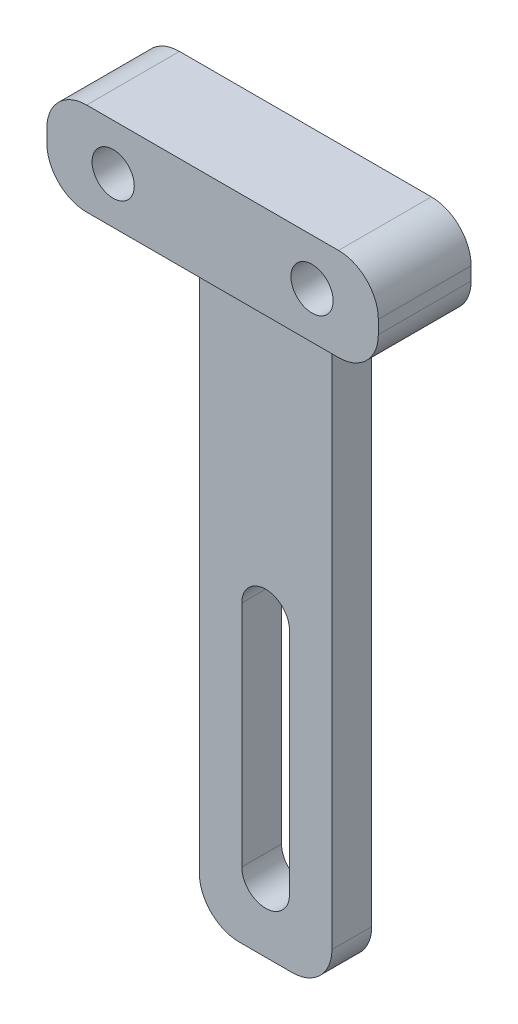
ISO-10303-21;
HEADER;
FILE_DESCRIPTION(('STEP AP214'),'2;1');
FILE_NAME('part.step','',(''),(''),'','','');
FILE_SCHEMA(('AUTOMOTIVE_DESIGN { 1 0 10303 214 1 1 1 1 }'));
ENDSEC;
DATA;
#1=APPLICATION_CONTEXT('core data for automotive mechanical design processes');
#2=APPLICATION_PROTOCOL_DEFINITION('international standard','automotive_design',2000,#1);
#3=PRODUCT_CONTEXT('',#1,'mechanical');
#4=PRODUCT('Part','Part','',(#3));
#5=PRODUCT_RELATED_PRODUCT_CATEGORY('part','',(#4));
#6=PRODUCT_DEFINITION_FORMATION('','',#4);
#7=PRODUCT_DEFINITION_CONTEXT('part definition',#1,'design');
#8=PRODUCT_DEFINITION('design','',#6,#7);
#9=PRODUCT_DEFINITION_SHAPE('','',#8);
#10=(LENGTH_UNIT() NAMED_UNIT(*) SI_UNIT(.MILLI.,.METRE.));
#11=(NAMED_UNIT(*) PLANE_ANGLE_UNIT() SI_UNIT($,.RADIAN.));
#12=(NAMED_UNIT(*) SI_UNIT($,.STERADIAN.) SOLID_ANGLE_UNIT());
#13=UNCERTAINTY_MEASURE_WITH_UNIT(LENGTH_MEASURE(1.E-05),#10,'distance_accuracy_value','');
#14=(GEOMETRIC_REPRESENTATION_CONTEXT(3) GLOBAL_UNCERTAINTY_ASSIGNED_CONTEXT((#13)) GLOBAL_UNIT_ASSIGNED_CONTEXT((#10,
#11,#12)) REPRESENTATION_CONTEXT('',''));
#15=CARTESIAN_POINT('',(0.,0.,0.));
#16=DIRECTION('',(0.,0.,1.));
#17=DIRECTION('',(1.,0.,0.));
#18=AXIS2_PLACEMENT_3D('',#15,#16,#17);
#19=CARTESIAN_POINT('',(0.,0.,3.));
#20=DIRECTION('',(0.,0.,1.));
#21=DIRECTION('',(1.,0.,0.));
#22=AXIS2_PLACEMENT_3D('',#19,#20,#21);
#23=PLANE('',#22);
#24=DIRECTION('',(0.,-1.,0.));
#25=VECTOR('',#24,1.);
#26=CARTESIAN_POINT('',(-22.5496659852599,17.2378238341969,3.));
#27=LINE('',#26,#25);
#28=CARTESIAN_POINT('',(-22.5496659852599,14.2378238341969,3.));
#29=VERTEX_POINT('',#28);
#30=CARTESIAN_POINT('',(-22.5496659852599,-25.6844897396889,3.));
#31=VERTEX_POINT('',#30);
#32=EDGE_CURVE('E216',#29,#31,#27,.T.);
#33=ORIENTED_EDGE('',*,*,#32,.T.);
#34=CARTESIAN_POINT('',(-19.5496659852599,-25.6844897396889,3.));
#35=DIRECTION('',(0.,0.,1.));
#36=DIRECTION('',(1.,0.,0.));
#37=AXIS2_PLACEMENT_3D('',#34,#35,#36);
#38=CIRCLE('',#37,3.);
#39=CARTESIAN_POINT('',(-19.5496659852599,-28.6844897396889,3.));
#40=VERTEX_POINT('',#39);
#41=EDGE_CURVE('E281',#31,#40,#38,.T.);
#42=ORIENTED_EDGE('',*,*,#41,.T.);
#43=DIRECTION('',(1.,0.,0.));
#44=VECTOR('',#43,1.);
#45=CARTESIAN_POINT('',(-22.5496659852599,-28.6844897396889,3.));
#46=LINE('',#45,#44);
#47=CARTESIAN_POINT('',(-15.5496659852599,-28.6844897396889,3.));
#48=VERTEX_POINT('',#47);
#49=EDGE_CURVE('E219',#40,#48,#46,.T.);
#50=ORIENTED_EDGE('',*,*,#49,.T.);
#51=CARTESIAN_POINT('',(-15.5496659852599,-25.6844897396889,3.));
#52=DIRECTION('',(0.,0.,1.));
#53=DIRECTION('',(1.,0.,0.));
#54=AXIS2_PLACEMENT_3D('',#51,#52,#53);
#55=CIRCLE('',#54,3.);
#56=CARTESIAN_POINT('',(-12.5496659852599,-25.6844897396889,3.));
#57=VERTEX_POINT('',#56);
#58=EDGE_CURVE('E279',#48,#57,#55,.T.);
#59=ORIENTED_EDGE('',*,*,#58,.T.);
#60=DIRECTION('',(0.,1.,0.));
#61=VECTOR('',#60,1.);
#62=CARTESIAN_POINT('',(-12.5496659852599,17.2378238341969,3.));
#63=LINE('',#62,#61);
#64=CARTESIAN_POINT('',(-12.5496659852599,14.2378238341969,3.));
#65=VERTEX_POINT('',#64);
#66=EDGE_CURVE('E223',#57,#65,#63,.T.);
#67=ORIENTED_EDGE('',*,*,#66,.T.);
#68=DIRECTION('',(1.,0.,0.));
#69=VECTOR('',#68,1.);
#70=CARTESIAN_POINT('',(0.,14.2378238341969,3.));
#71=LINE('',#70,#69);
#72=EDGE_CURVE('E277',#65,#29,#71,.F.);
#73=ORIENTED_EDGE('',*,*,#72,.T.);
#74=EDGE_LOOP('',(#33,#42,#50,#59,#67,#73));
#75=FACE_BOUND('',#74,.T.);
#76=DIRECTION('',(0.,1.,0.));
#77=VECTOR('',#76,1.);
#78=CARTESIAN_POINT('',(-15.7496659852599,-23.6844897396889,3.));
#79=LINE('',#78,#77);
#80=CARTESIAN_POINT('',(-15.7496659852599,-23.6844897396889,3.));
#81=VERTEX_POINT('',#80);
#82=CARTESIAN_POINT('',(-15.7496659852599,-6.43836240090095,3.));
#83=VERTEX_POINT('',#82);
#84=EDGE_CURVE('E183',#81,#83,#79,.T.);
#85=ORIENTED_EDGE('',*,*,#84,.F.);
#86=CARTESIAN_POINT('',(-17.5496659852599,-23.6844897396889,3.));
#87=DIRECTION('',(0.,0.,1.));
#88=DIRECTION('',(1.,0.,0.));
#89=AXIS2_PLACEMENT_3D('',#86,#87,#88);
#90=CIRCLE('',#89,1.8);
#91=CARTESIAN_POINT('',(-19.3496659852599,-23.6844897396889,3.));
#92=VERTEX_POINT('',#91);
#93=EDGE_CURVE('E173',#92,#81,#90,.T.);
#94=ORIENTED_EDGE('',*,*,#93,.F.);
#95=DIRECTION('',(0.,-1.,0.));
#96=VECTOR('',#95,1.);
#97=CARTESIAN_POINT('',(-19.3496659852599,-23.6844897396889,3.));
#98=LINE('',#97,#96);
#99=CARTESIAN_POINT('',(-19.3496659852599,-6.43836240090095,3.));
#100=VERTEX_POINT('',#99);
#101=EDGE_CURVE('E198',#100,#92,#98,.T.);
#102=ORIENTED_EDGE('',*,*,#101,.F.);
#103=CARTESIAN_POINT('',(-17.5496659852599,-6.43836240090095,3.));
#104=DIRECTION('',(0.,0.,1.));
#105=DIRECTION('',(1.,0.,0.));
#106=AXIS2_PLACEMENT_3D('',#103,#104,#105);
#107=CIRCLE('',#106,1.8);
#108=EDGE_CURVE('E196',#83,#100,#107,.T.);
#109=ORIENTED_EDGE('',*,*,#108,.F.);
#110=EDGE_LOOP('',(#85,#94,#102,#109));
#111=FACE_BOUND('',#110,.T.);
#112=ADVANCED_FACE('F32',(#75,#111),#23,.T.);
#113=CARTESIAN_POINT('',(0.,0.,0.));
#114=DIRECTION('',(0.,0.,1.));
#115=DIRECTION('',(1.,0.,0.));
#116=AXIS2_PLACEMENT_3D('',#113,#114,#115);
#117=PLANE('',#116);
#118=CARTESIAN_POINT('',(-10.0496659852599,20.7378238341969,0.));
#119=DIRECTION('',(0.,0.,1.));
#120=DIRECTION('',(1.,0.,0.));
#121=AXIS2_PLACEMENT_3D('',#118,#119,#120);
#122=CIRCLE('',#121,1.59228830838789);
#123=CARTESIAN_POINT('',(-8.457377676872,20.7378238341969,0.));
#124=VERTEX_POINT('',#123);
#125=EDGE_CURVE('E256',#124,#124,#122,.T.);
#126=ORIENTED_EDGE('',*,*,#125,.T.);
#127=EDGE_LOOP('',(#126));
#128=FACE_BOUND('',#127,.T.);
#129=CARTESIAN_POINT('',(-25.0496659852599,20.7378238341969,0.));
#130=DIRECTION('',(0.,0.,1.));
#131=DIRECTION('',(1.,0.,0.));
#132=AXIS2_PLACEMENT_3D('',#129,#130,#131);
#133=CIRCLE('',#132,1.59228830838789);
#134=CARTESIAN_POINT('',(-23.457377676872,20.7378238341969,0.));
#135=VERTEX_POINT('',#134);
#136=EDGE_CURVE('E252',#135,#135,#133,.T.);
#137=ORIENTED_EDGE('',*,*,#136,.T.);
#138=EDGE_LOOP('',(#137));
#139=FACE_BOUND('',#138,.T.);
#140=DIRECTION('',(1.,0.,0.));
#141=VECTOR('',#140,1.);
#142=CARTESIAN_POINT('',(-22.5496659852599,-28.6844897396889,0.));
#143=LINE('',#142,#141);
#144=CARTESIAN_POINT('',(-19.5496659852599,-28.6844897396889,0.));
#145=VERTEX_POINT('',#144);
#146=CARTESIAN_POINT('',(-15.5496659852599,-28.6844897396889,0.));
#147=VERTEX_POINT('',#146);
#148=EDGE_CURVE('E240',#145,#147,#143,.T.);
#149=ORIENTED_EDGE('',*,*,#148,.F.);
#150=CARTESIAN_POINT('',(-19.5496659852599,-25.6844897396889,0.));
#151=DIRECTION('',(0.,0.,1.));
#152=DIRECTION('',(1.,0.,0.));
#153=AXIS2_PLACEMENT_3D('',#150,#151,#152);
#154=CIRCLE('',#153,3.);
#155=CARTESIAN_POINT('',(-22.5496659852599,-25.6844897396889,0.));
#156=VERTEX_POINT('',#155);
#157=EDGE_CURVE('E271',#145,#156,#154,.F.);
#158=ORIENTED_EDGE('',*,*,#157,.T.);
#159=DIRECTION('',(0.,-1.,0.));
#160=VECTOR('',#159,1.);
#161=CARTESIAN_POINT('',(-22.5496659852599,17.2378238341969,0.));
#162=LINE('',#161,#160);
#163=CARTESIAN_POINT('',(-22.5496659852599,14.2378238341969,0.));
#164=VERTEX_POINT('',#163);
#165=EDGE_CURVE('E237',#164,#156,#162,.T.);
#166=ORIENTED_EDGE('',*,*,#165,.F.);
#167=CARTESIAN_POINT('',(-25.5496659852599,14.2378238341969,0.));
#168=DIRECTION('',(0.,0.,1.));
#169=DIRECTION('',(1.,0.,0.));
#170=AXIS2_PLACEMENT_3D('',#167,#168,#169);
#171=CIRCLE('',#170,3.);
#172=CARTESIAN_POINT('',(-25.5496659852599,17.2378238341969,0.));
#173=VERTEX_POINT('',#172);
#174=EDGE_CURVE('E11',#164,#173,#171,.T.);
#175=ORIENTED_EDGE('',*,*,#174,.T.);
#176=DIRECTION('',(1.,0.,0.));
#177=VECTOR('',#176,1.);
#178=CARTESIAN_POINT('',(-30.0496659852599,17.2378238341969,0.));
#179=LINE('',#178,#177);
#180=CARTESIAN_POINT('',(-27.0496659852599,17.2378238341969,0.));
#181=VERTEX_POINT('',#180);
#182=EDGE_CURVE('E234',#181,#173,#179,.T.);
#183=ORIENTED_EDGE('',*,*,#182,.F.);
#184=CARTESIAN_POINT('',(-27.0496659852599,20.2378238341969,0.));
#185=DIRECTION('',(0.,0.,1.));
#186=DIRECTION('',(1.,0.,0.));
#187=AXIS2_PLACEMENT_3D('',#184,#185,#186);
#188=CIRCLE('',#187,3.);
#189=CARTESIAN_POINT('',(-30.0496659852599,20.2378238341969,0.));
#190=VERTEX_POINT('',#189);
#191=EDGE_CURVE('E267',#181,#190,#188,.F.);
#192=ORIENTED_EDGE('',*,*,#191,.T.);
#193=DIRECTION('',(0.,-1.,0.));
#194=VECTOR('',#193,1.);
#195=CARTESIAN_POINT('',(-30.0496659852599,24.2378238341969,0.));
#196=LINE('',#195,#194);
#197=CARTESIAN_POINT('',(-30.0496659852599,21.2378238341969,0.));
#198=VERTEX_POINT('',#197);
#199=EDGE_CURVE('E231',#198,#190,#196,.T.);
#200=ORIENTED_EDGE('',*,*,#199,.F.);
#201=CARTESIAN_POINT('',(-27.0496659852599,21.2378238341969,0.));
#202=DIRECTION('',(0.,0.,1.));
#203=DIRECTION('',(1.,0.,0.));
#204=AXIS2_PLACEMENT_3D('',#201,#202,#203);
#205=CIRCLE('',#204,3.);
#206=CARTESIAN_POINT('',(-27.0496659852599,24.2378238341969,0.));
#207=VERTEX_POINT('',#206);
#208=EDGE_CURVE('E265',#198,#207,#205,.F.);
#209=ORIENTED_EDGE('',*,*,#208,.T.);
#210=DIRECTION('',(-1.,0.,0.));
#211=VECTOR('',#210,1.);
#212=CARTESIAN_POINT('',(-30.0496659852599,24.2378238341969,0.));
#213=LINE('',#212,#211);
#214=CARTESIAN_POINT('',(-8.04966598525989,24.2378238341969,0.));
#215=VERTEX_POINT('',#214);
#216=EDGE_CURVE('E229',#215,#207,#213,.T.);
#217=ORIENTED_EDGE('',*,*,#216,.F.);
#218=CARTESIAN_POINT('',(-8.04966598525989,21.2378238341969,0.));
#219=DIRECTION('',(0.,0.,1.));
#220=DIRECTION('',(1.,0.,0.));
#221=AXIS2_PLACEMENT_3D('',#218,#219,#220);
#222=CIRCLE('',#221,3.);
#223=CARTESIAN_POINT('',(-5.04966598525989,21.2378238341969,0.));
#224=VERTEX_POINT('',#223);
#225=EDGE_CURVE('E261',#215,#224,#222,.F.);
#226=ORIENTED_EDGE('',*,*,#225,.T.);
#227=DIRECTION('',(0.,1.,0.));
#228=VECTOR('',#227,1.);
#229=CARTESIAN_POINT('',(-5.04966598525989,24.2378238341969,0.));
#230=LINE('',#229,#228);
#231=CARTESIAN_POINT('',(-5.04966598525989,20.2378238341969,0.));
#232=VERTEX_POINT('',#231);
#233=EDGE_CURVE('E191',#232,#224,#230,.T.);
#234=ORIENTED_EDGE('',*,*,#233,.F.);
#235=CARTESIAN_POINT('',(-8.04966598525989,20.2378238341969,0.));
#236=DIRECTION('',(0.,0.,1.));
#237=DIRECTION('',(1.,0.,0.));
#238=AXIS2_PLACEMENT_3D('',#235,#236,#237);
#239=CIRCLE('',#238,3.);
#240=CARTESIAN_POINT('',(-8.04966598525989,17.2378238341969,0.));
#241=VERTEX_POINT('',#240);
#242=EDGE_CURVE('E263',#232,#241,#239,.F.);
#243=ORIENTED_EDGE('',*,*,#242,.T.);
#244=DIRECTION('',(1.,0.,0.));
#245=VECTOR('',#244,1.);
#246=CARTESIAN_POINT('',(-12.5496659852599,17.2378238341969,0.));
#247=LINE('',#246,#245);
#248=CARTESIAN_POINT('',(-9.54966598525989,17.2378238341969,0.));
#249=VERTEX_POINT('',#248);
#250=EDGE_CURVE('E220',#249,#241,#247,.T.);
#251=ORIENTED_EDGE('',*,*,#250,.F.);
#252=CARTESIAN_POINT('',(-9.54966598525989,14.2378238341969,0.));
#253=DIRECTION('',(0.,0.,1.));
#254=DIRECTION('',(1.,0.,0.));
#255=AXIS2_PLACEMENT_3D('',#252,#253,#254);
#256=CIRCLE('',#255,3.);
#257=CARTESIAN_POINT('',(-12.5496659852599,14.2378238341969,0.));
#258=VERTEX_POINT('',#257);
#259=EDGE_CURVE('E41',#249,#258,#256,.T.);
#260=ORIENTED_EDGE('',*,*,#259,.T.);
#261=DIRECTION('',(0.,1.,0.));
#262=VECTOR('',#261,1.);
#263=CARTESIAN_POINT('',(-12.5496659852599,17.2378238341969,0.));
#264=LINE('',#263,#262);
#265=CARTESIAN_POINT('',(-12.5496659852599,-25.6844897396889,0.));
#266=VERTEX_POINT('',#265);
#267=EDGE_CURVE('E243',#266,#258,#264,.T.);
#268=ORIENTED_EDGE('',*,*,#267,.F.);
#269=CARTESIAN_POINT('',(-15.5496659852599,-25.6844897396889,0.));
#270=DIRECTION('',(0.,0.,1.));
#271=DIRECTION('',(1.,0.,0.));
#272=AXIS2_PLACEMENT_3D('',#269,#270,#271);
#273=CIRCLE('',#272,3.);
#274=EDGE_CURVE('E269',#266,#147,#273,.F.);
#275=ORIENTED_EDGE('',*,*,#274,.T.);
#276=EDGE_LOOP('',(#149,#158,#166,#175,#183,#192,#200,#209,#217,#226,#234,#243,#251,#260,#268,#275));
#277=FACE_BOUND('',#276,.T.);
#278=CARTESIAN_POINT('',(-17.5496659852599,-23.6844897396889,0.));
#279=DIRECTION('',(0.,0.,1.));
#280=DIRECTION('',(1.,0.,0.));
#281=AXIS2_PLACEMENT_3D('',#278,#279,#280);
#282=CIRCLE('',#281,1.8);
#283=CARTESIAN_POINT('',(-19.3496659852599,-23.6844897396889,0.));
#284=VERTEX_POINT('',#283);
#285=CARTESIAN_POINT('',(-15.7496659852599,-23.6844897396889,0.));
#286=VERTEX_POINT('',#285);
#287=EDGE_CURVE('E203',#284,#286,#282,.T.);
#288=ORIENTED_EDGE('',*,*,#287,.T.);
#289=DIRECTION('',(0.,1.,0.));
#290=VECTOR('',#289,1.);
#291=CARTESIAN_POINT('',(-15.7496659852599,-23.6844897396889,0.));
#292=LINE('',#291,#290);
#293=CARTESIAN_POINT('',(-15.7496659852599,-6.43836240090095,0.));
#294=VERTEX_POINT('',#293);
#295=EDGE_CURVE('E190',#286,#294,#292,.T.);
#296=ORIENTED_EDGE('',*,*,#295,.T.);
#297=CARTESIAN_POINT('',(-17.5496659852599,-6.43836240090095,0.));
#298=DIRECTION('',(0.,0.,1.));
#299=DIRECTION('',(1.,0.,0.));
#300=AXIS2_PLACEMENT_3D('',#297,#298,#299);
#301=CIRCLE('',#300,1.8);
#302=CARTESIAN_POINT('',(-19.3496659852599,-6.43836240090095,0.));
#303=VERTEX_POINT('',#302);
#304=EDGE_CURVE('E207',#294,#303,#301,.T.);
#305=ORIENTED_EDGE('',*,*,#304,.T.);
#306=DIRECTION('',(0.,-1.,0.));
#307=VECTOR('',#306,1.);
#308=CARTESIAN_POINT('',(-19.3496659852599,-23.6844897396889,0.));
#309=LINE('',#308,#307);
#310=EDGE_CURVE('E184',#303,#284,#309,.T.);
#311=ORIENTED_EDGE('',*,*,#310,.T.);
#312=EDGE_LOOP('',(#288,#296,#305,#311));
#313=FACE_BOUND('',#312,.T.);
#314=ADVANCED_FACE('F352',(#128,#139,#277,#313),#117,.F.);
#315=CARTESIAN_POINT('',(-5.04966598525989,24.2378238341969,3.));
#316=DIRECTION('',(-1.,0.,0.));
#317=DIRECTION('',(0.,-1.,0.));
#318=AXIS2_PLACEMENT_3D('',#315,#316,#317);
#319=PLANE('',#318);
#320=DIRECTION('',(0.,-1.,0.));
#321=VECTOR('',#320,1.);
#322=CARTESIAN_POINT('',(-5.04966598525989,24.2378238341969,7.));
#323=LINE('',#322,#321);
#324=CARTESIAN_POINT('',(-5.04966598525989,21.2378238341969,7.));
#325=VERTEX_POINT('',#324);
#326=CARTESIAN_POINT('',(-5.04966598525989,20.2378238341969,7.));
#327=VERTEX_POINT('',#326);
#328=EDGE_CURVE('E341',#325,#327,#323,.T.);
#329=ORIENTED_EDGE('',*,*,#328,.T.);
#330=DIRECTION('',(0.,0.,-1.));
#331=VECTOR('',#330,1.);
#332=CARTESIAN_POINT('',(-5.04966598525989,20.2378238341969,3.));
#333=LINE('',#332,#331);
#334=EDGE_CURVE('E318',#327,#232,#333,.T.);
#335=ORIENTED_EDGE('',*,*,#334,.T.);
#336=ORIENTED_EDGE('',*,*,#233,.T.);
#337=DIRECTION('',(0.,0.,-1.));
#338=VECTOR('',#337,1.);
#339=CARTESIAN_POINT('',(-5.04966598525989,21.2378238341969,3.));
#340=LINE('',#339,#338);
#341=EDGE_CURVE('E316',#224,#325,#340,.F.);
#342=ORIENTED_EDGE('',*,*,#341,.T.);
#343=EDGE_LOOP('',(#329,#335,#336,#342));
#344=FACE_BOUND('',#343,.T.);
#345=ADVANCED_FACE('F355',(#344),#319,.F.);
#346=CARTESIAN_POINT('',(-30.0496659852599,24.2378238341969,3.));
#347=DIRECTION('',(0.,-1.,0.));
#348=DIRECTION('',(0.,0.,-1.));
#349=AXIS2_PLACEMENT_3D('',#346,#347,#348);
#350=PLANE('',#349);
#351=ORIENTED_EDGE('',*,*,#216,.T.);
#352=DIRECTION('',(0.,0.,-1.));
#353=VECTOR('',#352,1.);
#354=CARTESIAN_POINT('',(-27.0496659852599,24.2378238341969,3.));
#355=LINE('',#354,#353);
#356=CARTESIAN_POINT('',(-27.0496659852599,24.2378238341969,7.));
#357=VERTEX_POINT('',#356);
#358=EDGE_CURVE('E56',#207,#357,#355,.F.);
#359=ORIENTED_EDGE('',*,*,#358,.T.);
#360=DIRECTION('',(1.,0.,0.));
#361=VECTOR('',#360,1.);
#362=CARTESIAN_POINT('',(-30.0496659852599,24.2378238341969,7.));
#363=LINE('',#362,#361);
#364=CARTESIAN_POINT('',(-8.04966598525989,24.2378238341969,7.));
#365=VERTEX_POINT('',#364);
#366=EDGE_CURVE('E205',#357,#365,#363,.T.);
#367=ORIENTED_EDGE('',*,*,#366,.T.);
#368=DIRECTION('',(0.,0.,-1.));
#369=VECTOR('',#368,1.);
#370=CARTESIAN_POINT('',(-8.04966598525989,24.2378238341969,3.));
#371=LINE('',#370,#369);
#372=EDGE_CURVE('E312',#365,#215,#371,.T.);
#373=ORIENTED_EDGE('',*,*,#372,.T.);
#374=EDGE_LOOP('',(#351,#359,#367,#373));
#375=FACE_BOUND('',#374,.T.);
#376=ADVANCED_FACE('F344',(#375),#350,.F.);
#377=CARTESIAN_POINT('',(-30.0496659852599,24.2378238341969,3.));
#378=DIRECTION('',(1.,0.,0.));
#379=DIRECTION('',(0.,0.,-1.));
#380=AXIS2_PLACEMENT_3D('',#377,#378,#379);
#381=PLANE('',#380);
#382=ORIENTED_EDGE('',*,*,#199,.T.);
#383=DIRECTION('',(0.,0.,-1.));
#384=VECTOR('',#383,1.);
#385=CARTESIAN_POINT('',(-30.0496659852599,20.2378238341969,3.));
#386=LINE('',#385,#384);
#387=CARTESIAN_POINT('',(-30.0496659852599,20.2378238341969,7.));
#388=VERTEX_POINT('',#387);
#389=EDGE_CURVE('E303',#190,#388,#386,.F.);
#390=ORIENTED_EDGE('',*,*,#389,.T.);
#391=DIRECTION('',(0.,-1.,0.));
#392=VECTOR('',#391,1.);
#393=CARTESIAN_POINT('',(-30.0496659852599,24.2378238341969,7.));
#394=LINE('',#393,#392);
#395=CARTESIAN_POINT('',(-30.0496659852599,21.2378238341969,7.));
#396=VERTEX_POINT('',#395);
#397=EDGE_CURVE('E251',#396,#388,#394,.T.);
#398=ORIENTED_EDGE('',*,*,#397,.F.);
#399=DIRECTION('',(0.,0.,-1.));
#400=VECTOR('',#399,1.);
#401=CARTESIAN_POINT('',(-30.0496659852599,21.2378238341969,3.));
#402=LINE('',#401,#400);
#403=EDGE_CURVE('E300',#396,#198,#402,.T.);
#404=ORIENTED_EDGE('',*,*,#403,.T.);
#405=EDGE_LOOP('',(#382,#390,#398,#404));
#406=FACE_BOUND('',#405,.T.);
#407=ADVANCED_FACE('F403',(#406),#381,.F.);
#408=CARTESIAN_POINT('',(-22.5496659852599,17.2378238341969,3.));
#409=DIRECTION('',(1.,0.,0.));
#410=DIRECTION('',(0.,0.,-1.));
#411=AXIS2_PLACEMENT_3D('',#408,#409,#410);
#412=PLANE('',#411);
#413=ORIENTED_EDGE('',*,*,#165,.T.);
#414=DIRECTION('',(0.,0.,-1.));
#415=VECTOR('',#414,1.);
#416=CARTESIAN_POINT('',(-22.5496659852599,-25.6844897396889,3.));
#417=LINE('',#416,#415);
#418=EDGE_CURVE('E275',#156,#31,#417,.F.);
#419=ORIENTED_EDGE('',*,*,#418,.T.);
#420=ORIENTED_EDGE('',*,*,#32,.F.);
#421=DIRECTION('',(0.,0.,-1.));
#422=VECTOR('',#421,1.);
#423=CARTESIAN_POINT('',(-22.5496659852599,14.2378238341969,0.));
#424=LINE('',#423,#422);
#425=EDGE_CURVE('E273',#29,#164,#424,.T.);
#426=ORIENTED_EDGE('',*,*,#425,.T.);
#427=EDGE_LOOP('',(#413,#419,#420,#426));
#428=FACE_BOUND('',#427,.T.);
#429=ADVANCED_FACE('F389',(#428),#412,.F.);
#430=CARTESIAN_POINT('',(-22.5496659852599,-28.6844897396889,3.));
#431=DIRECTION('',(0.,1.,0.));
#432=DIRECTION('',(0.,0.,1.));
#433=AXIS2_PLACEMENT_3D('',#430,#431,#432);
#434=PLANE('',#433);
#435=ORIENTED_EDGE('',*,*,#49,.F.);
#436=DIRECTION('',(0.,0.,-1.));
#437=VECTOR('',#436,1.);
#438=CARTESIAN_POINT('',(-19.5496659852599,-28.6844897396889,3.));
#439=LINE('',#438,#437);
#440=EDGE_CURVE('E258',#40,#145,#439,.T.);
#441=ORIENTED_EDGE('',*,*,#440,.T.);
#442=ORIENTED_EDGE('',*,*,#148,.T.);
#443=DIRECTION('',(0.,0.,-1.));
#444=VECTOR('',#443,1.);
#445=CARTESIAN_POINT('',(-15.5496659852599,-28.6844897396889,3.));
#446=LINE('',#445,#444);
#447=EDGE_CURVE('E226',#147,#48,#446,.F.);
#448=ORIENTED_EDGE('',*,*,#447,.T.);
#449=EDGE_LOOP('',(#435,#441,#442,#448));
#450=FACE_BOUND('',#449,.T.);
#451=ADVANCED_FACE('F380',(#450),#434,.F.);
#452=CARTESIAN_POINT('',(-12.5496659852599,17.2378238341969,3.));
#453=DIRECTION('',(-1.,0.,0.));
#454=DIRECTION('',(0.,0.,1.));
#455=AXIS2_PLACEMENT_3D('',#452,#453,#454);
#456=PLANE('',#455);
#457=ORIENTED_EDGE('',*,*,#66,.F.);
#458=DIRECTION('',(0.,0.,-1.));
#459=VECTOR('',#458,1.);
#460=CARTESIAN_POINT('',(-12.5496659852599,-25.6844897396889,3.));
#461=LINE('',#460,#459);
#462=EDGE_CURVE('E285',#57,#266,#461,.T.);
#463=ORIENTED_EDGE('',*,*,#462,.T.);
#464=ORIENTED_EDGE('',*,*,#267,.T.);
#465=DIRECTION('',(0.,0.,-1.));
#466=VECTOR('',#465,1.);
#467=CARTESIAN_POINT('',(-12.5496659852599,14.2378238341969,3.));
#468=LINE('',#467,#466);
#469=EDGE_CURVE('E283',#258,#65,#468,.F.);
#470=ORIENTED_EDGE('',*,*,#469,.T.);
#471=EDGE_LOOP('',(#457,#463,#464,#470));
#472=FACE_BOUND('',#471,.T.);
#473=ADVANCED_FACE('F372',(#472),#456,.F.);
#474=CARTESIAN_POINT('',(-12.5496659852599,17.2378238341969,3.));
#475=DIRECTION('',(0.,1.,0.));
#476=DIRECTION('',(0.,0.,1.));
#477=AXIS2_PLACEMENT_3D('',#474,#475,#476);
#478=PLANE('',#477);
#479=DIRECTION('',(1.,0.,0.));
#480=VECTOR('',#479,1.);
#481=CARTESIAN_POINT('',(-12.5496659852599,17.2378238341969,6.));
#482=LINE('',#481,#480);
#483=CARTESIAN_POINT('',(-25.5496659852599,17.2378238341969,6.));
#484=VERTEX_POINT('',#483);
#485=CARTESIAN_POINT('',(-9.54966598525989,17.2378238341969,6.));
#486=VERTEX_POINT('',#485);
#487=EDGE_CURVE('E295',#484,#486,#482,.T.);
#488=ORIENTED_EDGE('',*,*,#487,.T.);
#489=DIRECTION('',(0.,0.,-1.));
#490=VECTOR('',#489,1.);
#491=CARTESIAN_POINT('',(-9.54966598525989,17.2378238341969,0.));
#492=LINE('',#491,#490);
#493=EDGE_CURVE('E298',#486,#249,#492,.T.);
#494=ORIENTED_EDGE('',*,*,#493,.T.);
#495=ORIENTED_EDGE('',*,*,#250,.T.);
#496=DIRECTION('',(0.,0.,-1.));
#497=VECTOR('',#496,1.);
#498=CARTESIAN_POINT('',(-8.04966598525989,17.2378238341969,3.));
#499=LINE('',#498,#497);
#500=CARTESIAN_POINT('',(-8.04966598525989,17.2378238341969,7.));
#501=VERTEX_POINT('',#500);
#502=EDGE_CURVE('E288',#241,#501,#499,.F.);
#503=ORIENTED_EDGE('',*,*,#502,.T.);
#504=DIRECTION('',(1.,0.,0.));
#505=VECTOR('',#504,1.);
#506=CARTESIAN_POINT('',(-30.0496659852599,17.2378238341969,7.));
#507=LINE('',#506,#505);
#508=CARTESIAN_POINT('',(-27.0496659852599,17.2378238341969,7.));
#509=VERTEX_POINT('',#508);
#510=EDGE_CURVE('E338',#509,#501,#507,.T.);
#511=ORIENTED_EDGE('',*,*,#510,.F.);
#512=DIRECTION('',(0.,0.,-1.));
#513=VECTOR('',#512,1.);
#514=CARTESIAN_POINT('',(-27.0496659852599,17.2378238341969,3.));
#515=LINE('',#514,#513);
#516=EDGE_CURVE('E290',#509,#181,#515,.T.);
#517=ORIENTED_EDGE('',*,*,#516,.T.);
#518=ORIENTED_EDGE('',*,*,#182,.T.);
#519=DIRECTION('',(0.,0.,-1.));
#520=VECTOR('',#519,1.);
#521=CARTESIAN_POINT('',(-25.5496659852599,17.2378238341969,3.));
#522=LINE('',#521,#520);
#523=EDGE_CURVE('E293',#173,#484,#522,.F.);
#524=ORIENTED_EDGE('',*,*,#523,.T.);
#525=EDGE_LOOP('',(#488,#494,#495,#503,#511,#517,#518,#524));
#526=FACE_BOUND('',#525,.T.);
#527=ADVANCED_FACE('F364',(#526),#478,.F.);
#528=CARTESIAN_POINT('',(-17.5496659852599,-23.6844897396889,3.));
#529=DIRECTION('',(0.,0.,-1.));
#530=DIRECTION('',(-1.,0.,0.));
#531=AXIS2_PLACEMENT_3D('',#528,#529,#530);
#532=CYLINDRICAL_SURFACE('',#531,1.8);
#533=ORIENTED_EDGE('',*,*,#287,.F.);
#534=DIRECTION('',(0.,0.,-1.));
#535=VECTOR('',#534,1.);
#536=CARTESIAN_POINT('',(-19.3496659852599,-23.6844897396889,3.));
#537=LINE('',#536,#535);
#538=EDGE_CURVE('E179',#92,#284,#537,.T.);
#539=ORIENTED_EDGE('',*,*,#538,.F.);
#540=ORIENTED_EDGE('',*,*,#93,.T.);
#541=DIRECTION('',(0.,0.,-1.));
#542=VECTOR('',#541,1.);
#543=CARTESIAN_POINT('',(-15.7496659852599,-23.6844897396889,3.));
#544=LINE('',#543,#542);
#545=EDGE_CURVE('E176',#81,#286,#544,.T.);
#546=ORIENTED_EDGE('',*,*,#545,.T.);
#547=EDGE_LOOP('',(#533,#539,#540,#546));
#548=FACE_BOUND('',#547,.T.);
#549=ADVANCED_FACE('F175',(#548),#532,.F.);
#550=CARTESIAN_POINT('',(-15.7496659852599,-23.6844897396889,3.));
#551=DIRECTION('',(-1.,0.,0.));
#552=DIRECTION('',(0.,0.,1.));
#553=AXIS2_PLACEMENT_3D('',#550,#551,#552);
#554=PLANE('',#553);
#555=ORIENTED_EDGE('',*,*,#295,.F.);
#556=ORIENTED_EDGE('',*,*,#545,.F.);
#557=ORIENTED_EDGE('',*,*,#84,.T.);
#558=DIRECTION('',(0.,0.,-1.));
#559=VECTOR('',#558,1.);
#560=CARTESIAN_POINT('',(-15.7496659852599,-6.43836240090095,3.));
#561=LINE('',#560,#559);
#562=EDGE_CURVE('E192',#83,#294,#561,.T.);
#563=ORIENTED_EDGE('',*,*,#562,.T.);
#564=EDGE_LOOP('',(#555,#556,#557,#563));
#565=FACE_BOUND('',#564,.T.);
#566=ADVANCED_FACE('F187',(#565),#554,.T.);
#567=CARTESIAN_POINT('',(-17.5496659852599,-6.43836240090095,3.));
#568=DIRECTION('',(0.,0.,-1.));
#569=DIRECTION('',(-1.,0.,0.));
#570=AXIS2_PLACEMENT_3D('',#567,#568,#569);
#571=CYLINDRICAL_SURFACE('',#570,1.8);
#572=ORIENTED_EDGE('',*,*,#304,.F.);
#573=ORIENTED_EDGE('',*,*,#562,.F.);
#574=ORIENTED_EDGE('',*,*,#108,.T.);
#575=DIRECTION('',(0.,0.,-1.));
#576=VECTOR('',#575,1.);
#577=CARTESIAN_POINT('',(-19.3496659852599,-6.43836240090095,3.));
#578=LINE('',#577,#576);
#579=EDGE_CURVE('E213',#100,#303,#578,.T.);
#580=ORIENTED_EDGE('',*,*,#579,.T.);
#581=EDGE_LOOP('',(#572,#573,#574,#580));
#582=FACE_BOUND('',#581,.T.);
#583=ADVANCED_FACE('F421',(#582),#571,.F.);
#584=CARTESIAN_POINT('',(-19.3496659852599,-23.6844897396889,3.));
#585=DIRECTION('',(1.,0.,0.));
#586=DIRECTION('',(0.,0.,-1.));
#587=AXIS2_PLACEMENT_3D('',#584,#585,#586);
#588=PLANE('',#587);
#589=ORIENTED_EDGE('',*,*,#310,.F.);
#590=ORIENTED_EDGE('',*,*,#579,.F.);
#591=ORIENTED_EDGE('',*,*,#101,.T.);
#592=ORIENTED_EDGE('',*,*,#538,.T.);
#593=EDGE_LOOP('',(#589,#590,#591,#592));
#594=FACE_BOUND('',#593,.T.);
#595=ADVANCED_FACE('F411',(#594),#588,.T.);
#596=CARTESIAN_POINT('',(0.,0.,7.));
#597=DIRECTION('',(0.,0.,1.));
#598=DIRECTION('',(1.,0.,0.));
#599=AXIS2_PLACEMENT_3D('',#596,#597,#598);
#600=PLANE('',#599);
#601=CARTESIAN_POINT('',(-10.0496659852599,20.7378238341969,7.));
#602=DIRECTION('',(0.,0.,1.));
#603=DIRECTION('',(1.,0.,0.));
#604=AXIS2_PLACEMENT_3D('',#601,#602,#603);
#605=CIRCLE('',#604,1.59228830838789);
#606=CARTESIAN_POINT('',(-8.457377676872,20.7378238341969,7.));
#607=VERTEX_POINT('',#606);
#608=EDGE_CURVE('E253',#607,#607,#605,.F.);
#609=ORIENTED_EDGE('',*,*,#608,.T.);
#610=EDGE_LOOP('',(#609));
#611=FACE_BOUND('',#610,.T.);
#612=CARTESIAN_POINT('',(-25.0496659852599,20.7378238341969,7.));
#613=DIRECTION('',(0.,0.,1.));
#614=DIRECTION('',(1.,0.,0.));
#615=AXIS2_PLACEMENT_3D('',#612,#613,#614);
#616=CIRCLE('',#615,1.59228830838789);
#617=CARTESIAN_POINT('',(-23.457377676872,20.7378238341969,7.));
#618=VERTEX_POINT('',#617);
#619=EDGE_CURVE('E248',#618,#618,#616,.F.);
#620=ORIENTED_EDGE('',*,*,#619,.T.);
#621=EDGE_LOOP('',(#620));
#622=FACE_BOUND('',#621,.T.);
#623=ORIENTED_EDGE('',*,*,#397,.T.);
#624=CARTESIAN_POINT('',(-27.0496659852599,20.2378238341969,7.));
#625=DIRECTION('',(0.,0.,1.));
#626=DIRECTION('',(1.,0.,0.));
#627=AXIS2_PLACEMENT_3D('',#624,#625,#626);
#628=CIRCLE('',#627,3.);
#629=EDGE_CURVE('E310',#388,#509,#628,.T.);
#630=ORIENTED_EDGE('',*,*,#629,.T.);
#631=ORIENTED_EDGE('',*,*,#510,.T.);
#632=CARTESIAN_POINT('',(-8.04966598525989,20.2378238341969,7.));
#633=DIRECTION('',(0.,0.,1.));
#634=DIRECTION('',(1.,0.,0.));
#635=AXIS2_PLACEMENT_3D('',#632,#633,#634);
#636=CIRCLE('',#635,3.);
#637=EDGE_CURVE('E306',#501,#327,#636,.T.);
#638=ORIENTED_EDGE('',*,*,#637,.T.);
#639=ORIENTED_EDGE('',*,*,#328,.F.);
#640=CARTESIAN_POINT('',(-8.04966598525989,21.2378238341969,7.));
#641=DIRECTION('',(0.,0.,1.));
#642=DIRECTION('',(1.,0.,0.));
#643=AXIS2_PLACEMENT_3D('',#640,#641,#642);
#644=CIRCLE('',#643,3.);
#645=EDGE_CURVE('E49',#325,#365,#644,.T.);
#646=ORIENTED_EDGE('',*,*,#645,.T.);
#647=ORIENTED_EDGE('',*,*,#366,.F.);
#648=CARTESIAN_POINT('',(-27.0496659852599,21.2378238341969,7.));
#649=DIRECTION('',(0.,0.,1.));
#650=DIRECTION('',(1.,0.,0.));
#651=AXIS2_PLACEMENT_3D('',#648,#649,#650);
#652=CIRCLE('',#651,3.);
#653=EDGE_CURVE('E308',#357,#396,#652,.T.);
#654=ORIENTED_EDGE('',*,*,#653,.T.);
#655=EDGE_LOOP('',(#623,#630,#631,#638,#639,#646,#647,#654));
#656=FACE_BOUND('',#655,.T.);
#657=ADVANCED_FACE('F408',(#611,#622,#656),#600,.T.);
#658=CARTESIAN_POINT('',(-25.0496659852599,20.7378238341969,10.));
#659=DIRECTION('',(0.,0.,-1.));
#660=DIRECTION('',(-1.,0.,0.));
#661=AXIS2_PLACEMENT_3D('',#658,#659,#660);
#662=CYLINDRICAL_SURFACE('',#661,1.59228830838789);
#663=ORIENTED_EDGE('',*,*,#619,.F.);
#664=EDGE_LOOP('',(#663));
#665=FACE_BOUND('',#664,.T.);
#666=ORIENTED_EDGE('',*,*,#136,.F.);
#667=EDGE_LOOP('',(#666));
#668=FACE_BOUND('',#667,.T.);
#669=ADVANCED_FACE('F410',(#665,#668),#662,.F.);
#670=CARTESIAN_POINT('',(-10.0496659852599,20.7378238341969,10.));
#671=DIRECTION('',(0.,0.,-1.));
#672=DIRECTION('',(-1.,0.,0.));
#673=AXIS2_PLACEMENT_3D('',#670,#671,#672);
#674=CYLINDRICAL_SURFACE('',#673,1.59228830838789);
#675=ORIENTED_EDGE('',*,*,#608,.F.);
#676=EDGE_LOOP('',(#675));
#677=FACE_BOUND('',#676,.T.);
#678=ORIENTED_EDGE('',*,*,#125,.F.);
#679=EDGE_LOOP('',(#678));
#680=FACE_BOUND('',#679,.T.);
#681=ADVANCED_FACE('F418',(#677,#680),#674,.F.);
#682=CARTESIAN_POINT('',(-19.5496659852599,-25.6844897396889,3.));
#683=DIRECTION('',(0.,0.,-1.));
#684=DIRECTION('',(-1.,0.,0.));
#685=AXIS2_PLACEMENT_3D('',#682,#683,#684);
#686=CYLINDRICAL_SURFACE('',#685,3.);
#687=ORIENTED_EDGE('',*,*,#41,.F.);
#688=ORIENTED_EDGE('',*,*,#418,.F.);
#689=ORIENTED_EDGE('',*,*,#157,.F.);
#690=ORIENTED_EDGE('',*,*,#440,.F.);
#691=EDGE_LOOP('',(#687,#688,#689,#690));
#692=FACE_BOUND('',#691,.T.);
#693=ADVANCED_FACE('F384',(#692),#686,.T.);
#694=CARTESIAN_POINT('',(-15.5496659852599,-25.6844897396889,3.));
#695=DIRECTION('',(0.,0.,-1.));
#696=DIRECTION('',(-1.,0.,0.));
#697=AXIS2_PLACEMENT_3D('',#694,#695,#696);
#698=CYLINDRICAL_SURFACE('',#697,3.);
#699=ORIENTED_EDGE('',*,*,#58,.F.);
#700=ORIENTED_EDGE('',*,*,#447,.F.);
#701=ORIENTED_EDGE('',*,*,#274,.F.);
#702=ORIENTED_EDGE('',*,*,#462,.F.);
#703=EDGE_LOOP('',(#699,#700,#701,#702));
#704=FACE_BOUND('',#703,.T.);
#705=ADVANCED_FACE('F376',(#704),#698,.T.);
#706=CARTESIAN_POINT('',(-25.5496659852599,14.2378238341969,3.));
#707=DIRECTION('',(0.,0.,1.));
#708=DIRECTION('',(1.,0.,0.));
#709=AXIS2_PLACEMENT_3D('',#706,#707,#708);
#710=CYLINDRICAL_SURFACE('',#709,3.);
#711=ORIENTED_EDGE('',*,*,#174,.F.);
#712=ORIENTED_EDGE('',*,*,#425,.F.);
#713=CARTESIAN_POINT('',(-25.5496659852599,14.2378238341969,6.));
#714=DIRECTION('',(0.707106781186547,0.,0.707106781186547));
#715=DIRECTION('',(-0.707106781186547,0.,0.707106781186547));
#716=AXIS2_PLACEMENT_3D('',#713,#714,#715);
#717=ELLIPSE('',#716,4.24264068711928,3.);
#718=EDGE_CURVE('E36',#484,#29,#717,.F.);
#719=ORIENTED_EDGE('',*,*,#718,.F.);
#720=ORIENTED_EDGE('',*,*,#523,.F.);
#721=EDGE_LOOP('',(#711,#712,#719,#720));
#722=FACE_BOUND('',#721,.T.);
#723=ADVANCED_FACE('F393',(#722),#710,.F.);
#724=CARTESIAN_POINT('',(-9.54966598525989,14.2378238341969,3.));
#725=DIRECTION('',(0.,0.,1.));
#726=DIRECTION('',(1.,0.,0.));
#727=AXIS2_PLACEMENT_3D('',#724,#725,#726);
#728=CYLINDRICAL_SURFACE('',#727,3.);
#729=ORIENTED_EDGE('',*,*,#259,.F.);
#730=ORIENTED_EDGE('',*,*,#493,.F.);
#731=CARTESIAN_POINT('',(-9.54966598525989,14.2378238341969,6.));
#732=DIRECTION('',(-0.707106781186547,0.,0.707106781186547));
#733=DIRECTION('',(0.707106781186547,0.,0.707106781186547));
#734=AXIS2_PLACEMENT_3D('',#731,#732,#733);
#735=ELLIPSE('',#734,4.24264068711928,3.);
#736=EDGE_CURVE('E321',#65,#486,#735,.F.);
#737=ORIENTED_EDGE('',*,*,#736,.F.);
#738=ORIENTED_EDGE('',*,*,#469,.F.);
#739=EDGE_LOOP('',(#729,#730,#737,#738));
#740=FACE_BOUND('',#739,.T.);
#741=ADVANCED_FACE('F367',(#740),#728,.F.);
#742=CARTESIAN_POINT('',(-12.5496659852599,14.2378238341969,6.));
#743=DIRECTION('',(1.,0.,0.));
#744=DIRECTION('',(0.,0.,-1.));
#745=AXIS2_PLACEMENT_3D('',#742,#743,#744);
#746=CYLINDRICAL_SURFACE('',#745,3.);
#747=ORIENTED_EDGE('',*,*,#718,.T.);
#748=ORIENTED_EDGE('',*,*,#72,.F.);
#749=ORIENTED_EDGE('',*,*,#736,.T.);
#750=ORIENTED_EDGE('',*,*,#487,.F.);
#751=EDGE_LOOP('',(#747,#748,#749,#750));
#752=FACE_BOUND('',#751,.T.);
#753=ADVANCED_FACE('F453',(#752),#746,.F.);
#754=CARTESIAN_POINT('',(-27.0496659852599,20.2378238341969,3.));
#755=DIRECTION('',(0.,0.,-1.));
#756=DIRECTION('',(-1.,0.,0.));
#757=AXIS2_PLACEMENT_3D('',#754,#755,#756);
#758=CYLINDRICAL_SURFACE('',#757,3.);
#759=ORIENTED_EDGE('',*,*,#629,.F.);
#760=ORIENTED_EDGE('',*,*,#389,.F.);
#761=ORIENTED_EDGE('',*,*,#191,.F.);
#762=ORIENTED_EDGE('',*,*,#516,.F.);
#763=EDGE_LOOP('',(#759,#760,#761,#762));
#764=FACE_BOUND('',#763,.T.);
#765=ADVANCED_FACE('F399',(#764),#758,.T.);
#766=CARTESIAN_POINT('',(-27.0496659852599,21.2378238341969,3.));
#767=DIRECTION('',(0.,0.,-1.));
#768=DIRECTION('',(-1.,0.,0.));
#769=AXIS2_PLACEMENT_3D('',#766,#767,#768);
#770=CYLINDRICAL_SURFACE('',#769,3.);
#771=ORIENTED_EDGE('',*,*,#653,.F.);
#772=ORIENTED_EDGE('',*,*,#358,.F.);
#773=ORIENTED_EDGE('',*,*,#208,.F.);
#774=ORIENTED_EDGE('',*,*,#403,.F.);
#775=EDGE_LOOP('',(#771,#772,#773,#774));
#776=FACE_BOUND('',#775,.T.);
#777=ADVANCED_FACE('F407',(#776),#770,.T.);
#778=CARTESIAN_POINT('',(-8.04966598525989,20.2378238341969,3.));
#779=DIRECTION('',(0.,0.,-1.));
#780=DIRECTION('',(-1.,0.,0.));
#781=AXIS2_PLACEMENT_3D('',#778,#779,#780);
#782=CYLINDRICAL_SURFACE('',#781,3.);
#783=ORIENTED_EDGE('',*,*,#637,.F.);
#784=ORIENTED_EDGE('',*,*,#502,.F.);
#785=ORIENTED_EDGE('',*,*,#242,.F.);
#786=ORIENTED_EDGE('',*,*,#334,.F.);
#787=EDGE_LOOP('',(#783,#784,#785,#786));
#788=FACE_BOUND('',#787,.T.);
#789=ADVANCED_FACE('F359',(#788),#782,.T.);
#790=CARTESIAN_POINT('',(-8.04966598525989,21.2378238341969,3.));
#791=DIRECTION('',(0.,0.,-1.));
#792=DIRECTION('',(-1.,0.,0.));
#793=AXIS2_PLACEMENT_3D('',#790,#791,#792);
#794=CYLINDRICAL_SURFACE('',#793,3.);
#795=ORIENTED_EDGE('',*,*,#645,.F.);
#796=ORIENTED_EDGE('',*,*,#341,.F.);
#797=ORIENTED_EDGE('',*,*,#225,.F.);
#798=ORIENTED_EDGE('',*,*,#372,.F.);
#799=EDGE_LOOP('',(#795,#796,#797,#798));
#800=FACE_BOUND('',#799,.T.);
#801=ADVANCED_FACE('F34',(#800),#794,.T.);
#802=CLOSED_SHELL('',(#112,#314,#345,#376,#407,#429,#451,#473,#527,#549,#566,#583,#595,#657,
#669,#681,#693,#705,#723,#741,#753,#765,#777,#789,#801));
#803=MANIFOLD_SOLID_BREP('B2',#802);
#804=ADVANCED_BREP_SHAPE_REPRESENTATION('',(#18,#803),#14);
#805=SHAPE_DEFINITION_REPRESENTATION(#9,#804);
ENDSEC;
END-ISO-10303-21;
